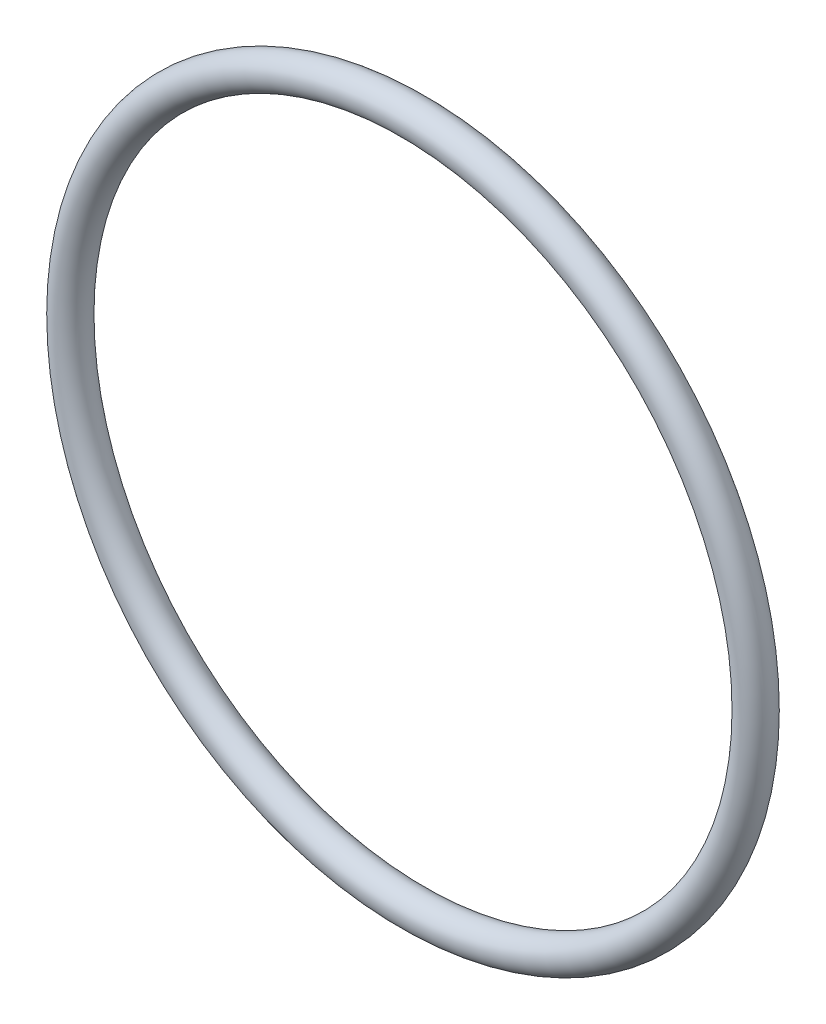
ISO-10303-21;
HEADER;
FILE_DESCRIPTION(('STEP AP214'),'2;1');
FILE_NAME('part.step','',(''),(''),'','','');
FILE_SCHEMA(('AUTOMOTIVE_DESIGN { 1 0 10303 214 1 1 1 1 }'));
ENDSEC;
DATA;
#1=APPLICATION_CONTEXT('core data for automotive mechanical design processes');
#2=APPLICATION_PROTOCOL_DEFINITION('international standard','automotive_design',2000,#1);
#3=PRODUCT_CONTEXT('',#1,'mechanical');
#4=PRODUCT('Part','Part','',(#3));
#5=PRODUCT_RELATED_PRODUCT_CATEGORY('part','',(#4));
#6=PRODUCT_DEFINITION_FORMATION('','',#4);
#7=PRODUCT_DEFINITION_CONTEXT('part definition',#1,'design');
#8=PRODUCT_DEFINITION('design','',#6,#7);
#9=PRODUCT_DEFINITION_SHAPE('','',#8);
#10=(LENGTH_UNIT() NAMED_UNIT(*) SI_UNIT(.MILLI.,.METRE.));
#11=(NAMED_UNIT(*) PLANE_ANGLE_UNIT() SI_UNIT($,.RADIAN.));
#12=(NAMED_UNIT(*) SI_UNIT($,.STERADIAN.) SOLID_ANGLE_UNIT());
#13=UNCERTAINTY_MEASURE_WITH_UNIT(LENGTH_MEASURE(1.E-05),#10,'distance_accuracy_value','');
#14=(GEOMETRIC_REPRESENTATION_CONTEXT(3) GLOBAL_UNCERTAINTY_ASSIGNED_CONTEXT((#13)) GLOBAL_UNIT_ASSIGNED_CONTEXT((#10,
#11,#12)) REPRESENTATION_CONTEXT('',''));
#15=CARTESIAN_POINT('',(0.,0.,0.));
#16=DIRECTION('',(0.,0.,1.));
#17=DIRECTION('',(1.,0.,0.));
#18=AXIS2_PLACEMENT_3D('',#15,#16,#17);
#19=CARTESIAN_POINT('',(0.,0.,0.));
#20=DIRECTION('',(0.,0.,1.));
#21=DIRECTION('',(1.,0.,0.));
#22=AXIS2_PLACEMENT_3D('',#19,#20,#21);
#23=TOROIDAL_SURFACE('',#22,18.2118,0.888999999999996);
#24=CARTESIAN_POINT('',(19.1008,0.,0.));
#25=VERTEX_POINT('',#24);
#26=VERTEX_LOOP('',#25);
#27=FACE_BOUND('',#26,.T.);
#28=ADVANCED_FACE('F35',(#27),#23,.T.);
#29=CLOSED_SHELL('',(#28));
#30=MANIFOLD_SOLID_BREP('B2',#29);
#31=ADVANCED_BREP_SHAPE_REPRESENTATION('',(#18,#30),#14);
#32=SHAPE_DEFINITION_REPRESENTATION(#9,#31);
ENDSEC;
END-ISO-10303-21;
